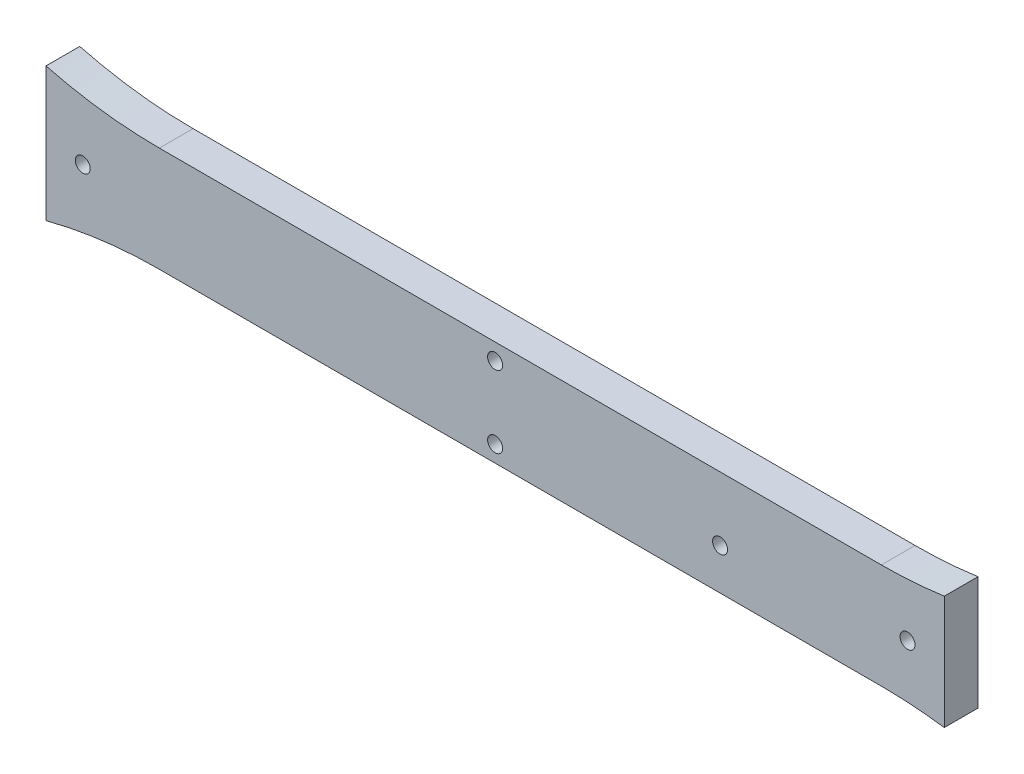
ISO-10303-21;
HEADER;
FILE_DESCRIPTION(('STEP AP214'),'2;1');
FILE_NAME('part.step','',(''),(''),'','','');
FILE_SCHEMA(('AUTOMOTIVE_DESIGN { 1 0 10303 214 1 1 1 1 }'));
ENDSEC;
DATA;
#1=APPLICATION_CONTEXT('core data for automotive mechanical design processes');
#2=APPLICATION_PROTOCOL_DEFINITION('international standard','automotive_design',2000,#1);
#3=PRODUCT_CONTEXT('',#1,'mechanical');
#4=PRODUCT('Part','Part','',(#3));
#5=PRODUCT_RELATED_PRODUCT_CATEGORY('part','',(#4));
#6=PRODUCT_DEFINITION_FORMATION('','',#4);
#7=PRODUCT_DEFINITION_CONTEXT('part definition',#1,'design');
#8=PRODUCT_DEFINITION('design','',#6,#7);
#9=PRODUCT_DEFINITION_SHAPE('','',#8);
#10=(LENGTH_UNIT() NAMED_UNIT(*) SI_UNIT(.MILLI.,.METRE.));
#11=(NAMED_UNIT(*) PLANE_ANGLE_UNIT() SI_UNIT($,.RADIAN.));
#12=(NAMED_UNIT(*) SI_UNIT($,.STERADIAN.) SOLID_ANGLE_UNIT());
#13=UNCERTAINTY_MEASURE_WITH_UNIT(LENGTH_MEASURE(1.E-05),#10,'distance_accuracy_value','');
#14=(GEOMETRIC_REPRESENTATION_CONTEXT(3) GLOBAL_UNCERTAINTY_ASSIGNED_CONTEXT((#13)) GLOBAL_UNIT_ASSIGNED_CONTEXT((#10,
#11,#12)) REPRESENTATION_CONTEXT('',''));
#15=CARTESIAN_POINT('',(0.,0.,0.));
#16=DIRECTION('',(0.,0.,1.));
#17=DIRECTION('',(1.,0.,0.));
#18=AXIS2_PLACEMENT_3D('',#15,#16,#17);
#19=CARTESIAN_POINT('',(0.,7.,4.5));
#20=DIRECTION('',(0.,1.,0.));
#21=DIRECTION('',(0.,0.,1.));
#22=AXIS2_PLACEMENT_3D('',#19,#20,#21);
#23=PLANE('',#22);
#24=DIRECTION('',(1.,0.,0.));
#25=VECTOR('',#24,1.);
#26=CARTESIAN_POINT('',(0.,7.,0.));
#27=LINE('',#26,#25);
#28=CARTESIAN_POINT('',(-44.7799735274768,7.,0.));
#29=VERTEX_POINT('',#28);
#30=CARTESIAN_POINT('',(51.5053197510586,7.,0.));
#31=VERTEX_POINT('',#30);
#32=EDGE_CURVE('E212',#29,#31,#27,.T.);
#33=ORIENTED_EDGE('',*,*,#32,.F.);
#34=DIRECTION('',(0.,0.,-1.));
#35=VECTOR('',#34,1.);
#36=CARTESIAN_POINT('',(-44.7799735274768,7.,4.5));
#37=LINE('',#36,#35);
#38=CARTESIAN_POINT('',(-44.7799735274768,7.,4.5));
#39=VERTEX_POINT('',#38);
#40=EDGE_CURVE('E219',#29,#39,#37,.F.);
#41=ORIENTED_EDGE('',*,*,#40,.T.);
#42=DIRECTION('',(1.,0.,0.));
#43=VECTOR('',#42,1.);
#44=CARTESIAN_POINT('',(0.,7.,4.5));
#45=LINE('',#44,#43);
#46=CARTESIAN_POINT('',(51.5053197510586,7.,4.5));
#47=VERTEX_POINT('',#46);
#48=EDGE_CURVE('E190',#39,#47,#45,.T.);
#49=ORIENTED_EDGE('',*,*,#48,.T.);
#50=DIRECTION('',(0.,0.,-1.));
#51=VECTOR('',#50,1.);
#52=CARTESIAN_POINT('',(51.5053197510586,7.,4.5));
#53=LINE('',#52,#51);
#54=EDGE_CURVE('E196',#47,#31,#53,.T.);
#55=ORIENTED_EDGE('',*,*,#54,.T.);
#56=EDGE_LOOP('',(#33,#41,#49,#55));
#57=FACE_BOUND('',#56,.T.);
#58=ADVANCED_FACE('F41',(#57),#23,.T.);
#59=CARTESIAN_POINT('',(0.,-4.8,4.5));
#60=DIRECTION('',(0.,0.,-1.));
#61=DIRECTION('',(-1.,0.,0.));
#62=AXIS2_PLACEMENT_3D('',#59,#60,#61);
#63=CYLINDRICAL_SURFACE('',#62,1.);
#64=CARTESIAN_POINT('',(0.,-4.8,4.5));
#65=DIRECTION('',(0.,0.,1.));
#66=DIRECTION('',(1.,0.,0.));
#67=AXIS2_PLACEMENT_3D('',#64,#65,#66);
#68=CIRCLE('',#67,1.);
#69=CARTESIAN_POINT('',(1.,-4.8,4.5));
#70=VERTEX_POINT('',#69);
#71=EDGE_CURVE('E186',#70,#70,#68,.T.);
#72=ORIENTED_EDGE('',*,*,#71,.T.);
#73=EDGE_LOOP('',(#72));
#74=FACE_BOUND('',#73,.T.);
#75=CARTESIAN_POINT('',(0.,-4.8,0.));
#76=DIRECTION('',(0.,0.,1.));
#77=DIRECTION('',(1.,0.,0.));
#78=AXIS2_PLACEMENT_3D('',#75,#76,#77);
#79=CIRCLE('',#78,1.);
#80=CARTESIAN_POINT('',(1.,-4.8,0.));
#81=VERTEX_POINT('',#80);
#82=EDGE_CURVE('E208',#81,#81,#79,.T.);
#83=ORIENTED_EDGE('',*,*,#82,.F.);
#84=EDGE_LOOP('',(#83));
#85=FACE_BOUND('',#84,.T.);
#86=ADVANCED_FACE('F253',(#74,#85),#63,.F.);
#87=CARTESIAN_POINT('',(0.,4.8,4.5));
#88=DIRECTION('',(0.,0.,-1.));
#89=DIRECTION('',(-1.,0.,0.));
#90=AXIS2_PLACEMENT_3D('',#87,#88,#89);
#91=CYLINDRICAL_SURFACE('',#90,1.);
#92=CARTESIAN_POINT('',(0.,4.8,4.5));
#93=DIRECTION('',(0.,0.,1.));
#94=DIRECTION('',(1.,0.,0.));
#95=AXIS2_PLACEMENT_3D('',#92,#93,#94);
#96=CIRCLE('',#95,1.);
#97=CARTESIAN_POINT('',(1.,4.8,4.5));
#98=VERTEX_POINT('',#97);
#99=EDGE_CURVE('E182',#98,#98,#96,.T.);
#100=ORIENTED_EDGE('',*,*,#99,.T.);
#101=EDGE_LOOP('',(#100));
#102=FACE_BOUND('',#101,.T.);
#103=CARTESIAN_POINT('',(0.,4.8,0.));
#104=DIRECTION('',(0.,0.,1.));
#105=DIRECTION('',(1.,0.,0.));
#106=AXIS2_PLACEMENT_3D('',#103,#104,#105);
#107=CIRCLE('',#106,1.);
#108=CARTESIAN_POINT('',(1.,4.8,0.));
#109=VERTEX_POINT('',#108);
#110=EDGE_CURVE('E204',#109,#109,#107,.T.);
#111=ORIENTED_EDGE('',*,*,#110,.F.);
#112=EDGE_LOOP('',(#111));
#113=FACE_BOUND('',#112,.T.);
#114=ADVANCED_FACE('F258',(#102,#113),#91,.F.);
#115=CARTESIAN_POINT('',(-55.,0.,4.5));
#116=DIRECTION('',(0.,0.,-1.));
#117=DIRECTION('',(-1.,0.,0.));
#118=AXIS2_PLACEMENT_3D('',#115,#116,#117);
#119=CYLINDRICAL_SURFACE('',#118,0.999999999999998);
#120=CARTESIAN_POINT('',(-55.,0.,4.5));
#121=DIRECTION('',(0.,0.,1.));
#122=DIRECTION('',(1.,0.,0.));
#123=AXIS2_PLACEMENT_3D('',#120,#121,#122);
#124=CIRCLE('',#123,0.999999999999998);
#125=CARTESIAN_POINT('',(-54.,0.,4.5));
#126=VERTEX_POINT('',#125);
#127=EDGE_CURVE('E177',#126,#126,#124,.T.);
#128=ORIENTED_EDGE('',*,*,#127,.T.);
#129=EDGE_LOOP('',(#128));
#130=FACE_BOUND('',#129,.T.);
#131=CARTESIAN_POINT('',(-55.,0.,0.));
#132=DIRECTION('',(0.,0.,1.));
#133=DIRECTION('',(1.,0.,0.));
#134=AXIS2_PLACEMENT_3D('',#131,#132,#133);
#135=CIRCLE('',#134,0.999999999999998);
#136=CARTESIAN_POINT('',(-54.,0.,0.));
#137=VERTEX_POINT('',#136);
#138=EDGE_CURVE('E200',#137,#137,#135,.T.);
#139=ORIENTED_EDGE('',*,*,#138,.F.);
#140=EDGE_LOOP('',(#139));
#141=FACE_BOUND('',#140,.T.);
#142=ADVANCED_FACE('F266',(#130,#141),#119,.F.);
#143=CARTESIAN_POINT('',(55.,0.,4.5));
#144=DIRECTION('',(0.,0.,-1.));
#145=DIRECTION('',(-1.,0.,0.));
#146=AXIS2_PLACEMENT_3D('',#143,#144,#145);
#147=CYLINDRICAL_SURFACE('',#146,0.999999999999998);
#148=CARTESIAN_POINT('',(55.,0.,4.5));
#149=DIRECTION('',(0.,0.,1.));
#150=DIRECTION('',(1.,0.,0.));
#151=AXIS2_PLACEMENT_3D('',#148,#149,#150);
#152=CIRCLE('',#151,0.999999999999998);
#153=CARTESIAN_POINT('',(56.,0.,4.5));
#154=VERTEX_POINT('',#153);
#155=EDGE_CURVE('E173',#154,#154,#152,.T.);
#156=ORIENTED_EDGE('',*,*,#155,.T.);
#157=EDGE_LOOP('',(#156));
#158=FACE_BOUND('',#157,.T.);
#159=CARTESIAN_POINT('',(55.,0.,0.));
#160=DIRECTION('',(0.,0.,1.));
#161=DIRECTION('',(1.,0.,0.));
#162=AXIS2_PLACEMENT_3D('',#159,#160,#161);
#163=CIRCLE('',#162,0.999999999999998);
#164=CARTESIAN_POINT('',(56.,0.,0.));
#165=VERTEX_POINT('',#164);
#166=EDGE_CURVE('E169',#165,#165,#163,.T.);
#167=ORIENTED_EDGE('',*,*,#166,.F.);
#168=EDGE_LOOP('',(#167));
#169=FACE_BOUND('',#168,.T.);
#170=ADVANCED_FACE('F270',(#158,#169),#147,.F.);
#171=CARTESIAN_POINT('',(0.,-7.,4.5));
#172=DIRECTION('',(0.,1.,0.));
#173=DIRECTION('',(0.,0.,1.));
#174=AXIS2_PLACEMENT_3D('',#171,#172,#173);
#175=PLANE('',#174);
#176=DIRECTION('',(1.,0.,0.));
#177=VECTOR('',#176,1.);
#178=CARTESIAN_POINT('',(0.,-7.,4.5));
#179=LINE('',#178,#177);
#180=CARTESIAN_POINT('',(-44.7799735274768,-7.,4.5));
#181=VERTEX_POINT('',#180);
#182=CARTESIAN_POINT('',(51.5053197510586,-7.,4.5));
#183=VERTEX_POINT('',#182);
#184=EDGE_CURVE('E193',#181,#183,#179,.T.);
#185=ORIENTED_EDGE('',*,*,#184,.F.);
#186=DIRECTION('',(0.,0.,1.));
#187=VECTOR('',#186,1.);
#188=CARTESIAN_POINT('',(-44.7799735274768,-7.,0.));
#189=LINE('',#188,#187);
#190=CARTESIAN_POINT('',(-44.7799735274768,-7.,0.));
#191=VERTEX_POINT('',#190);
#192=EDGE_CURVE('E224',#181,#191,#189,.F.);
#193=ORIENTED_EDGE('',*,*,#192,.T.);
#194=DIRECTION('',(1.,0.,0.));
#195=VECTOR('',#194,1.);
#196=CARTESIAN_POINT('',(0.,-7.,0.));
#197=LINE('',#196,#195);
#198=CARTESIAN_POINT('',(51.5053197510586,-7.,0.));
#199=VERTEX_POINT('',#198);
#200=EDGE_CURVE('E178',#191,#199,#197,.T.);
#201=ORIENTED_EDGE('',*,*,#200,.T.);
#202=DIRECTION('',(0.,0.,1.));
#203=VECTOR('',#202,1.);
#204=CARTESIAN_POINT('',(51.5053197510586,-7.,4.5));
#205=LINE('',#204,#203);
#206=EDGE_CURVE('E127',#199,#183,#205,.T.);
#207=ORIENTED_EDGE('',*,*,#206,.T.);
#208=EDGE_LOOP('',(#185,#193,#201,#207));
#209=FACE_BOUND('',#208,.T.);
#210=ADVANCED_FACE('F243',(#209),#175,.F.);
#211=CARTESIAN_POINT('',(0.,0.,4.5));
#212=DIRECTION('',(0.,0.,1.));
#213=DIRECTION('',(1.,0.,0.));
#214=AXIS2_PLACEMENT_3D('',#211,#212,#213);
#215=PLANE('',#214);
#216=DIRECTION('',(0.,-1.,0.));
#217=VECTOR('',#216,1.);
#218=CARTESIAN_POINT('',(59.9,0.,4.5));
#219=LINE('',#218,#217);
#220=CARTESIAN_POINT('',(59.9,7.59015785647943,4.5));
#221=VERTEX_POINT('',#220);
#222=CARTESIAN_POINT('',(59.9,-7.59015785647943,4.5));
#223=VERTEX_POINT('',#222);
#224=EDGE_CURVE('E107',#221,#223,#219,.T.);
#225=ORIENTED_EDGE('',*,*,#224,.F.);
#226=CARTESIAN_POINT('',(51.5053197510586,67.,4.5));
#227=DIRECTION('',(0.,0.,1.));
#228=DIRECTION('',(1.,0.,0.));
#229=AXIS2_PLACEMENT_3D('',#226,#227,#228);
#230=CIRCLE('',#229,60.);
#231=EDGE_CURVE('E141',#221,#47,#230,.F.);
#232=ORIENTED_EDGE('',*,*,#231,.T.);
#233=ORIENTED_EDGE('',*,*,#48,.F.);
#234=CARTESIAN_POINT('',(-44.7799735274768,67.,4.5));
#235=DIRECTION('',(0.,0.,1.));
#236=DIRECTION('',(1.,0.,0.));
#237=AXIS2_PLACEMENT_3D('',#234,#235,#236);
#238=CIRCLE('',#237,60.);
#239=CARTESIAN_POINT('',(-59.9,8.93637283573994,4.5));
#240=VERTEX_POINT('',#239);
#241=EDGE_CURVE('E231',#39,#240,#238,.F.);
#242=ORIENTED_EDGE('',*,*,#241,.T.);
#243=DIRECTION('',(0.,1.,0.));
#244=VECTOR('',#243,1.);
#245=CARTESIAN_POINT('',(-59.9,0.,4.5));
#246=LINE('',#245,#244);
#247=CARTESIAN_POINT('',(-59.9,-8.93637283573994,4.5));
#248=VERTEX_POINT('',#247);
#249=EDGE_CURVE('E113',#248,#240,#246,.T.);
#250=ORIENTED_EDGE('',*,*,#249,.F.);
#251=CARTESIAN_POINT('',(-44.7799735274768,-67.,4.5));
#252=DIRECTION('',(0.,0.,1.));
#253=DIRECTION('',(1.,0.,0.));
#254=AXIS2_PLACEMENT_3D('',#251,#252,#253);
#255=CIRCLE('',#254,60.);
#256=EDGE_CURVE('E130',#248,#181,#255,.F.);
#257=ORIENTED_EDGE('',*,*,#256,.T.);
#258=ORIENTED_EDGE('',*,*,#184,.T.);
#259=CARTESIAN_POINT('',(51.5053197510586,-67.,4.5));
#260=DIRECTION('',(0.,0.,1.));
#261=DIRECTION('',(1.,0.,0.));
#262=AXIS2_PLACEMENT_3D('',#259,#260,#261);
#263=CIRCLE('',#262,60.);
#264=EDGE_CURVE('E129',#183,#223,#263,.F.);
#265=ORIENTED_EDGE('',*,*,#264,.T.);
#266=EDGE_LOOP('',(#225,#232,#233,#242,#250,#257,#258,#265));
#267=FACE_BOUND('',#266,.T.);
#268=CARTESIAN_POINT('',(30.,-1.5,4.5));
#269=DIRECTION('',(0.,0.,-1.));
#270=DIRECTION('',(-1.,0.,0.));
#271=AXIS2_PLACEMENT_3D('',#268,#269,#270);
#272=CIRCLE('',#271,0.999999999999998);
#273=CARTESIAN_POINT('',(29.,-1.5,4.5));
#274=VERTEX_POINT('',#273);
#275=EDGE_CURVE('E165',#274,#274,#272,.T.);
#276=ORIENTED_EDGE('',*,*,#275,.T.);
#277=EDGE_LOOP('',(#276));
#278=FACE_BOUND('',#277,.T.);
#279=ORIENTED_EDGE('',*,*,#155,.F.);
#280=EDGE_LOOP('',(#279));
#281=FACE_BOUND('',#280,.T.);
#282=ORIENTED_EDGE('',*,*,#127,.F.);
#283=EDGE_LOOP('',(#282));
#284=FACE_BOUND('',#283,.T.);
#285=ORIENTED_EDGE('',*,*,#99,.F.);
#286=EDGE_LOOP('',(#285));
#287=FACE_BOUND('',#286,.T.);
#288=ORIENTED_EDGE('',*,*,#71,.F.);
#289=EDGE_LOOP('',(#288));
#290=FACE_BOUND('',#289,.T.);
#291=ADVANCED_FACE('F149',(#267,#278,#281,#284,#287,#290),#215,.T.);
#292=CARTESIAN_POINT('',(0.,0.,0.));
#293=DIRECTION('',(0.,0.,1.));
#294=DIRECTION('',(1.,0.,0.));
#295=AXIS2_PLACEMENT_3D('',#292,#293,#294);
#296=PLANE('',#295);
#297=CARTESIAN_POINT('',(30.,-1.5,0.));
#298=DIRECTION('',(0.,0.,-1.));
#299=DIRECTION('',(-1.,0.,0.));
#300=AXIS2_PLACEMENT_3D('',#297,#298,#299);
#301=CIRCLE('',#300,0.999999999999998);
#302=CARTESIAN_POINT('',(29.,-1.5,0.));
#303=VERTEX_POINT('',#302);
#304=EDGE_CURVE('E164',#303,#303,#301,.T.);
#305=ORIENTED_EDGE('',*,*,#304,.F.);
#306=EDGE_LOOP('',(#305));
#307=FACE_BOUND('',#306,.T.);
#308=ORIENTED_EDGE('',*,*,#166,.T.);
#309=EDGE_LOOP('',(#308));
#310=FACE_BOUND('',#309,.T.);
#311=ORIENTED_EDGE('',*,*,#138,.T.);
#312=EDGE_LOOP('',(#311));
#313=FACE_BOUND('',#312,.T.);
#314=ORIENTED_EDGE('',*,*,#110,.T.);
#315=EDGE_LOOP('',(#314));
#316=FACE_BOUND('',#315,.T.);
#317=ORIENTED_EDGE('',*,*,#82,.T.);
#318=EDGE_LOOP('',(#317));
#319=FACE_BOUND('',#318,.T.);
#320=CARTESIAN_POINT('',(51.5053197510586,67.,0.));
#321=DIRECTION('',(0.,0.,1.));
#322=DIRECTION('',(1.,0.,0.));
#323=AXIS2_PLACEMENT_3D('',#320,#321,#322);
#324=CIRCLE('',#323,60.);
#325=CARTESIAN_POINT('',(59.9,7.59015785647943,0.));
#326=VERTEX_POINT('',#325);
#327=EDGE_CURVE('E122',#31,#326,#324,.T.);
#328=ORIENTED_EDGE('',*,*,#327,.T.);
#329=DIRECTION('',(0.,1.,0.));
#330=VECTOR('',#329,1.);
#331=CARTESIAN_POINT('',(59.9,-17.5891547968701,0.));
#332=LINE('',#331,#330);
#333=CARTESIAN_POINT('',(59.9,-7.59015785647943,0.));
#334=VERTEX_POINT('',#333);
#335=EDGE_CURVE('E64',#334,#326,#332,.T.);
#336=ORIENTED_EDGE('',*,*,#335,.F.);
#337=CARTESIAN_POINT('',(51.5053197510586,-67.,0.));
#338=DIRECTION('',(0.,0.,1.));
#339=DIRECTION('',(1.,0.,0.));
#340=AXIS2_PLACEMENT_3D('',#337,#338,#339);
#341=CIRCLE('',#340,60.);
#342=EDGE_CURVE('E119',#334,#199,#341,.T.);
#343=ORIENTED_EDGE('',*,*,#342,.T.);
#344=ORIENTED_EDGE('',*,*,#200,.F.);
#345=CARTESIAN_POINT('',(-44.7799735274768,-67.,0.));
#346=DIRECTION('',(0.,0.,1.));
#347=DIRECTION('',(1.,0.,0.));
#348=AXIS2_PLACEMENT_3D('',#345,#346,#347);
#349=CIRCLE('',#348,60.);
#350=CARTESIAN_POINT('',(-59.9,-8.93637283573994,0.));
#351=VERTEX_POINT('',#350);
#352=EDGE_CURVE('E135',#191,#351,#349,.T.);
#353=ORIENTED_EDGE('',*,*,#352,.T.);
#354=DIRECTION('',(0.,-1.,0.));
#355=VECTOR('',#354,1.);
#356=CARTESIAN_POINT('',(-59.9,-24.3897459421062,0.));
#357=LINE('',#356,#355);
#358=CARTESIAN_POINT('',(-59.9,8.93637283573994,0.));
#359=VERTEX_POINT('',#358);
#360=EDGE_CURVE('E57',#359,#351,#357,.T.);
#361=ORIENTED_EDGE('',*,*,#360,.F.);
#362=CARTESIAN_POINT('',(-44.7799735274768,67.,0.));
#363=DIRECTION('',(0.,0.,1.));
#364=DIRECTION('',(1.,0.,0.));
#365=AXIS2_PLACEMENT_3D('',#362,#363,#364);
#366=CIRCLE('',#365,60.);
#367=EDGE_CURVE('E228',#359,#29,#366,.T.);
#368=ORIENTED_EDGE('',*,*,#367,.T.);
#369=ORIENTED_EDGE('',*,*,#32,.T.);
#370=EDGE_LOOP('',(#328,#336,#343,#344,#353,#361,#368,#369));
#371=FACE_BOUND('',#370,.T.);
#372=ADVANCED_FACE('F117',(#307,#310,#313,#316,#319,#371),#296,.F.);
#373=CARTESIAN_POINT('',(30.,-1.5,4.5));
#374=DIRECTION('',(0.,0.,-1.));
#375=DIRECTION('',(-1.,0.,0.));
#376=AXIS2_PLACEMENT_3D('',#373,#374,#375);
#377=CYLINDRICAL_SURFACE('',#376,0.999999999999998);
#378=ORIENTED_EDGE('',*,*,#275,.F.);
#379=EDGE_LOOP('',(#378));
#380=FACE_BOUND('',#379,.T.);
#381=ORIENTED_EDGE('',*,*,#304,.T.);
#382=EDGE_LOOP('',(#381));
#383=FACE_BOUND('',#382,.T.);
#384=ADVANCED_FACE('F277',(#380,#383),#377,.F.);
#385=CARTESIAN_POINT('',(-44.7799735274768,67.,43.8314123824711));
#386=DIRECTION('',(0.,0.,-1.));
#387=DIRECTION('',(-1.,0.,0.));
#388=AXIS2_PLACEMENT_3D('',#385,#386,#387);
#389=CYLINDRICAL_SURFACE('',#388,60.);
#390=ORIENTED_EDGE('',*,*,#367,.F.);
#391=DIRECTION('',(0.,0.,-1.));
#392=VECTOR('',#391,1.);
#393=CARTESIAN_POINT('',(-59.9,8.93637283573994,43.8314123824711));
#394=LINE('',#393,#392);
#395=EDGE_CURVE('E160',#359,#240,#394,.F.);
#396=ORIENTED_EDGE('',*,*,#395,.T.);
#397=ORIENTED_EDGE('',*,*,#241,.F.);
#398=ORIENTED_EDGE('',*,*,#40,.F.);
#399=EDGE_LOOP('',(#390,#396,#397,#398));
#400=FACE_BOUND('',#399,.T.);
#401=ADVANCED_FACE('F248',(#400),#389,.F.);
#402=CARTESIAN_POINT('',(-44.7799735274768,-67.,43.8314123824711));
#403=DIRECTION('',(0.,0.,-1.));
#404=DIRECTION('',(-1.,0.,0.));
#405=AXIS2_PLACEMENT_3D('',#402,#403,#404);
#406=CYLINDRICAL_SURFACE('',#405,60.);
#407=ORIENTED_EDGE('',*,*,#256,.F.);
#408=DIRECTION('',(0.,0.,-1.));
#409=VECTOR('',#408,1.);
#410=CARTESIAN_POINT('',(-59.9,-8.93637283573994,43.8314123824711));
#411=LINE('',#410,#409);
#412=EDGE_CURVE('E11',#248,#351,#411,.T.);
#413=ORIENTED_EDGE('',*,*,#412,.T.);
#414=ORIENTED_EDGE('',*,*,#352,.F.);
#415=ORIENTED_EDGE('',*,*,#192,.F.);
#416=EDGE_LOOP('',(#407,#413,#414,#415));
#417=FACE_BOUND('',#416,.T.);
#418=ADVANCED_FACE('F240',(#417),#406,.F.);
#419=CARTESIAN_POINT('',(51.5053197510586,-67.,43.8314123824711));
#420=DIRECTION('',(0.,0.,-1.));
#421=DIRECTION('',(-1.,0.,0.));
#422=AXIS2_PLACEMENT_3D('',#419,#420,#421);
#423=CYLINDRICAL_SURFACE('',#422,60.);
#424=ORIENTED_EDGE('',*,*,#342,.F.);
#425=DIRECTION('',(0.,0.,-1.));
#426=VECTOR('',#425,1.);
#427=CARTESIAN_POINT('',(59.9,-7.59015785647943,43.8314123824711));
#428=LINE('',#427,#426);
#429=EDGE_CURVE('E104',#334,#223,#428,.F.);
#430=ORIENTED_EDGE('',*,*,#429,.T.);
#431=ORIENTED_EDGE('',*,*,#264,.F.);
#432=ORIENTED_EDGE('',*,*,#206,.F.);
#433=EDGE_LOOP('',(#424,#430,#431,#432));
#434=FACE_BOUND('',#433,.T.);
#435=ADVANCED_FACE('F126',(#434),#423,.F.);
#436=CARTESIAN_POINT('',(51.5053197510586,67.,43.8314123824711));
#437=DIRECTION('',(0.,0.,-1.));
#438=DIRECTION('',(-1.,0.,0.));
#439=AXIS2_PLACEMENT_3D('',#436,#437,#438);
#440=CYLINDRICAL_SURFACE('',#439,60.);
#441=ORIENTED_EDGE('',*,*,#231,.F.);
#442=DIRECTION('',(0.,0.,-1.));
#443=VECTOR('',#442,1.);
#444=CARTESIAN_POINT('',(59.9,7.59015785647943,43.8314123824711));
#445=LINE('',#444,#443);
#446=EDGE_CURVE('E50',#221,#326,#445,.T.);
#447=ORIENTED_EDGE('',*,*,#446,.T.);
#448=ORIENTED_EDGE('',*,*,#327,.F.);
#449=ORIENTED_EDGE('',*,*,#54,.F.);
#450=EDGE_LOOP('',(#441,#447,#448,#449));
#451=FACE_BOUND('',#450,.T.);
#452=ADVANCED_FACE('F43',(#451),#440,.F.);
#453=CARTESIAN_POINT('',(59.9,-17.5891547968701,10.));
#454=DIRECTION('',(-1.,0.,0.));
#455=DIRECTION('',(0.,0.,1.));
#456=AXIS2_PLACEMENT_3D('',#453,#454,#455);
#457=PLANE('',#456);
#458=ORIENTED_EDGE('',*,*,#335,.T.);
#459=ORIENTED_EDGE('',*,*,#446,.F.);
#460=ORIENTED_EDGE('',*,*,#224,.T.);
#461=ORIENTED_EDGE('',*,*,#429,.F.);
#462=EDGE_LOOP('',(#458,#459,#460,#461));
#463=FACE_BOUND('',#462,.T.);
#464=ADVANCED_FACE('F105',(#463),#457,.F.);
#465=CARTESIAN_POINT('',(-59.9,-24.3897459421062,10.));
#466=DIRECTION('',(1.,0.,0.));
#467=DIRECTION('',(0.,0.,-1.));
#468=AXIS2_PLACEMENT_3D('',#465,#466,#467);
#469=PLANE('',#468);
#470=ORIENTED_EDGE('',*,*,#360,.T.);
#471=ORIENTED_EDGE('',*,*,#412,.F.);
#472=ORIENTED_EDGE('',*,*,#249,.T.);
#473=ORIENTED_EDGE('',*,*,#395,.F.);
#474=EDGE_LOOP('',(#470,#471,#472,#473));
#475=FACE_BOUND('',#474,.T.);
#476=ADVANCED_FACE('F246',(#475),#469,.F.);
#477=CLOSED_SHELL('',(#58,#86,#114,#142,#170,#210,#291,#372,#384,#401,#418,#435,#452,#464,#476));
#478=MANIFOLD_SOLID_BREP('B2',#477);
#479=ADVANCED_BREP_SHAPE_REPRESENTATION('',(#18,#478),#14);
#480=SHAPE_DEFINITION_REPRESENTATION(#9,#479);
ENDSEC;
END-ISO-10303-21;
